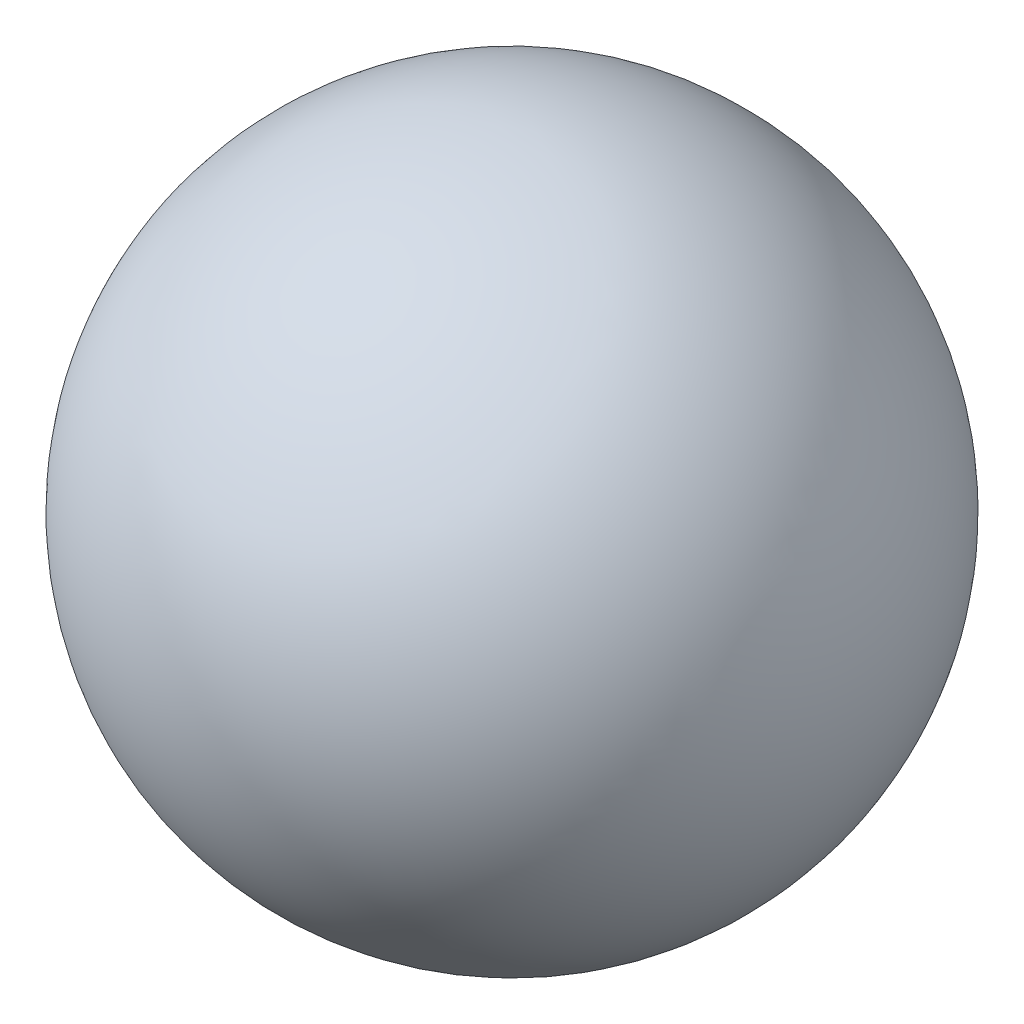
ISO-10303-21;
HEADER;
FILE_DESCRIPTION(('STEP AP214'),'2;1');
FILE_NAME('part.step','',(''),(''),'','','');
FILE_SCHEMA(('AUTOMOTIVE_DESIGN { 1 0 10303 214 1 1 1 1 }'));
ENDSEC;
DATA;
#1=APPLICATION_CONTEXT('core data for automotive mechanical design processes');
#2=APPLICATION_PROTOCOL_DEFINITION('international standard','automotive_design',2000,#1);
#3=PRODUCT_CONTEXT('',#1,'mechanical');
#4=PRODUCT('Part','Part','',(#3));
#5=PRODUCT_RELATED_PRODUCT_CATEGORY('part','',(#4));
#6=PRODUCT_DEFINITION_FORMATION('','',#4);
#7=PRODUCT_DEFINITION_CONTEXT('part definition',#1,'design');
#8=PRODUCT_DEFINITION('design','',#6,#7);
#9=PRODUCT_DEFINITION_SHAPE('','',#8);
#10=(LENGTH_UNIT() NAMED_UNIT(*) SI_UNIT(.MILLI.,.METRE.));
#11=(NAMED_UNIT(*) PLANE_ANGLE_UNIT() SI_UNIT($,.RADIAN.));
#12=(NAMED_UNIT(*) SI_UNIT($,.STERADIAN.) SOLID_ANGLE_UNIT());
#13=UNCERTAINTY_MEASURE_WITH_UNIT(LENGTH_MEASURE(1.E-05),#10,'distance_accuracy_value','');
#14=(GEOMETRIC_REPRESENTATION_CONTEXT(3) GLOBAL_UNCERTAINTY_ASSIGNED_CONTEXT((#13)) GLOBAL_UNIT_ASSIGNED_CONTEXT((#10,
#11,#12)) REPRESENTATION_CONTEXT('',''));
#15=CARTESIAN_POINT('',(0.,0.,0.));
#16=DIRECTION('',(0.,0.,1.));
#17=DIRECTION('',(1.,0.,0.));
#18=AXIS2_PLACEMENT_3D('',#15,#16,#17);
#19=CARTESIAN_POINT('',(0.,0.,0.));
#20=DIRECTION('',(1.,0.,0.));
#21=DIRECTION('',(0.,0.,1.));
#22=AXIS2_PLACEMENT_3D('',#19,#20,#21);
#23=SPHERICAL_SURFACE('',#22,0.762);
#24=CARTESIAN_POINT('',(0.762,0.,0.));
#25=VERTEX_POINT('',#24);
#26=VERTEX_LOOP('',#25);
#27=FACE_BOUND('',#26,.T.);
#28=ADVANCED_FACE('F31',(#27),#23,.T.);
#29=CLOSED_SHELL('',(#28));
#30=MANIFOLD_SOLID_BREP('B2',#29);
#31=ADVANCED_BREP_SHAPE_REPRESENTATION('',(#18,#30),#14);
#32=SHAPE_DEFINITION_REPRESENTATION(#9,#31);
ENDSEC;
END-ISO-10303-21;
